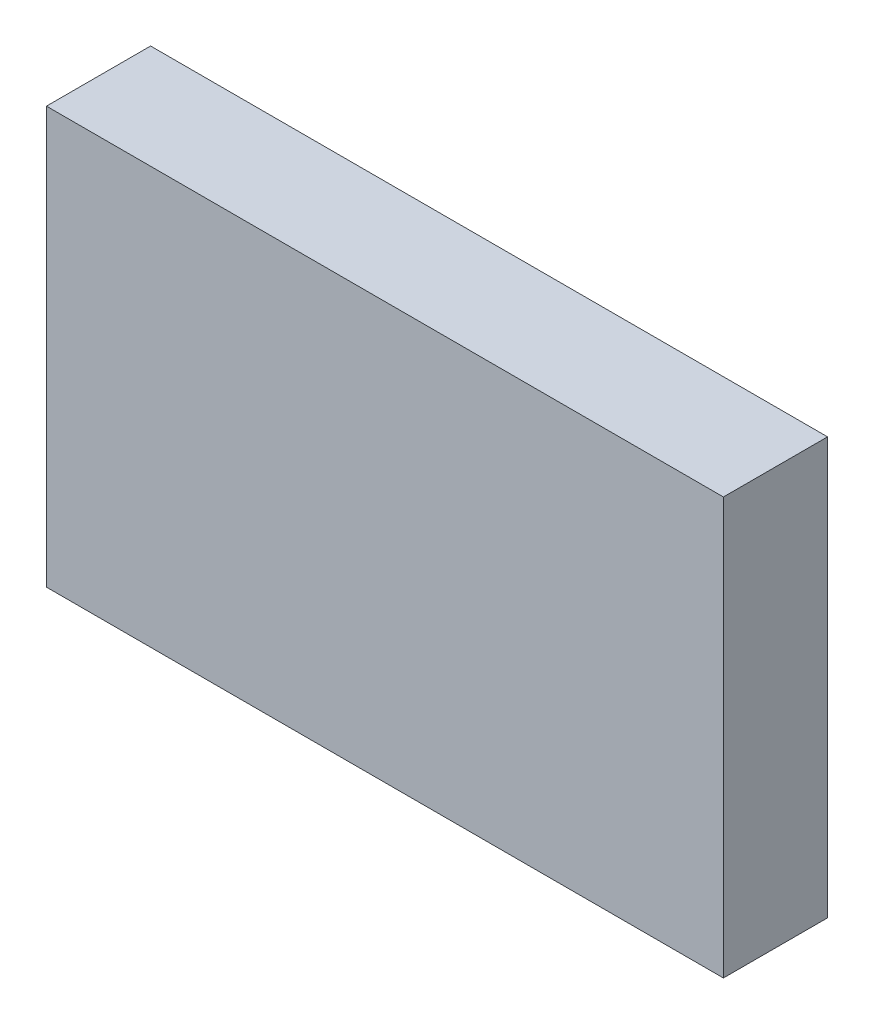
ISO-10303-21;
HEADER;
FILE_DESCRIPTION(('STEP AP214'),'2;1');
FILE_NAME('part.step','',(''),(''),'','','');
FILE_SCHEMA(('AUTOMOTIVE_DESIGN { 1 0 10303 214 1 1 1 1 }'));
ENDSEC;
DATA;
#1=APPLICATION_CONTEXT('core data for automotive mechanical design processes');
#2=APPLICATION_PROTOCOL_DEFINITION('international standard','automotive_design',2000,#1);
#3=PRODUCT_CONTEXT('',#1,'mechanical');
#4=PRODUCT('Part','Part','',(#3));
#5=PRODUCT_RELATED_PRODUCT_CATEGORY('part','',(#4));
#6=PRODUCT_DEFINITION_FORMATION('','',#4);
#7=PRODUCT_DEFINITION_CONTEXT('part definition',#1,'design');
#8=PRODUCT_DEFINITION('design','',#6,#7);
#9=PRODUCT_DEFINITION_SHAPE('','',#8);
#10=(LENGTH_UNIT() NAMED_UNIT(*) SI_UNIT(.MILLI.,.METRE.));
#11=(NAMED_UNIT(*) PLANE_ANGLE_UNIT() SI_UNIT($,.RADIAN.));
#12=(NAMED_UNIT(*) SI_UNIT($,.STERADIAN.) SOLID_ANGLE_UNIT());
#13=UNCERTAINTY_MEASURE_WITH_UNIT(LENGTH_MEASURE(1.E-05),#10,'distance_accuracy_value','');
#14=(GEOMETRIC_REPRESENTATION_CONTEXT(3) GLOBAL_UNCERTAINTY_ASSIGNED_CONTEXT((#13)) GLOBAL_UNIT_ASSIGNED_CONTEXT((#10,
#11,#12)) REPRESENTATION_CONTEXT('',''));
#15=CARTESIAN_POINT('',(0.,0.,0.));
#16=DIRECTION('',(0.,0.,1.));
#17=DIRECTION('',(1.,0.,0.));
#18=AXIS2_PLACEMENT_3D('',#15,#16,#17);
#19=CARTESIAN_POINT('',(0.,8.,2.));
#20=DIRECTION('',(1.,0.,0.));
#21=DIRECTION('',(0.,0.,-1.));
#22=AXIS2_PLACEMENT_3D('',#19,#20,#21);
#23=PLANE('',#22);
#24=DIRECTION('',(0.,-1.,0.));
#25=VECTOR('',#24,1.);
#26=CARTESIAN_POINT('',(0.,8.,0.));
#27=LINE('',#26,#25);
#28=CARTESIAN_POINT('',(0.,8.,0.));
#29=VERTEX_POINT('',#28);
#30=CARTESIAN_POINT('',(0.,0.,0.));
#31=VERTEX_POINT('',#30);
#32=EDGE_CURVE('E102',#29,#31,#27,.T.);
#33=ORIENTED_EDGE('',*,*,#32,.T.);
#34=DIRECTION('',(0.,0.,-1.));
#35=VECTOR('',#34,1.);
#36=CARTESIAN_POINT('',(0.,0.,2.));
#37=LINE('',#36,#35);
#38=CARTESIAN_POINT('',(0.,0.,2.));
#39=VERTEX_POINT('',#38);
#40=EDGE_CURVE('E11',#39,#31,#37,.T.);
#41=ORIENTED_EDGE('',*,*,#40,.F.);
#42=DIRECTION('',(0.,-1.,0.));
#43=VECTOR('',#42,1.);
#44=CARTESIAN_POINT('',(0.,8.,2.));
#45=LINE('',#44,#43);
#46=CARTESIAN_POINT('',(0.,8.,2.));
#47=VERTEX_POINT('',#46);
#48=EDGE_CURVE('E90',#47,#39,#45,.T.);
#49=ORIENTED_EDGE('',*,*,#48,.F.);
#50=DIRECTION('',(0.,0.,-1.));
#51=VECTOR('',#50,1.);
#52=CARTESIAN_POINT('',(0.,8.,2.));
#53=LINE('',#52,#51);
#54=EDGE_CURVE('E98',#47,#29,#53,.T.);
#55=ORIENTED_EDGE('',*,*,#54,.T.);
#56=EDGE_LOOP('',(#33,#41,#49,#55));
#57=FACE_BOUND('',#56,.T.);
#58=ADVANCED_FACE('F39',(#57),#23,.F.);
#59=CARTESIAN_POINT('',(0.,0.,2.));
#60=DIRECTION('',(0.,1.,0.));
#61=DIRECTION('',(0.,0.,1.));
#62=AXIS2_PLACEMENT_3D('',#59,#60,#61);
#63=PLANE('',#62);
#64=DIRECTION('',(1.,0.,0.));
#65=VECTOR('',#64,1.);
#66=CARTESIAN_POINT('',(0.,0.,0.));
#67=LINE('',#66,#65);
#68=CARTESIAN_POINT('',(13.,0.,0.));
#69=VERTEX_POINT('',#68);
#70=EDGE_CURVE('E94',#31,#69,#67,.T.);
#71=ORIENTED_EDGE('',*,*,#70,.T.);
#72=DIRECTION('',(0.,0.,-1.));
#73=VECTOR('',#72,1.);
#74=CARTESIAN_POINT('',(13.,0.,2.));
#75=LINE('',#74,#73);
#76=CARTESIAN_POINT('',(13.,0.,2.));
#77=VERTEX_POINT('',#76);
#78=EDGE_CURVE('E47',#77,#69,#75,.T.);
#79=ORIENTED_EDGE('',*,*,#78,.F.);
#80=DIRECTION('',(1.,0.,0.));
#81=VECTOR('',#80,1.);
#82=CARTESIAN_POINT('',(0.,0.,2.));
#83=LINE('',#82,#81);
#84=EDGE_CURVE('E85',#39,#77,#83,.T.);
#85=ORIENTED_EDGE('',*,*,#84,.F.);
#86=ORIENTED_EDGE('',*,*,#40,.T.);
#87=EDGE_LOOP('',(#71,#79,#85,#86));
#88=FACE_BOUND('',#87,.T.);
#89=ADVANCED_FACE('F93',(#88),#63,.F.);
#90=CARTESIAN_POINT('',(13.,0.,2.));
#91=DIRECTION('',(-1.,0.,0.));
#92=DIRECTION('',(0.,0.,1.));
#93=AXIS2_PLACEMENT_3D('',#90,#91,#92);
#94=PLANE('',#93);
#95=DIRECTION('',(0.,1.,0.));
#96=VECTOR('',#95,1.);
#97=CARTESIAN_POINT('',(13.,0.,0.));
#98=LINE('',#97,#96);
#99=CARTESIAN_POINT('',(13.,8.,0.));
#100=VERTEX_POINT('',#99);
#101=EDGE_CURVE('E72',#69,#100,#98,.T.);
#102=ORIENTED_EDGE('',*,*,#101,.T.);
#103=DIRECTION('',(0.,0.,-1.));
#104=VECTOR('',#103,1.);
#105=CARTESIAN_POINT('',(13.,8.,2.));
#106=LINE('',#105,#104);
#107=CARTESIAN_POINT('',(13.,8.,2.));
#108=VERTEX_POINT('',#107);
#109=EDGE_CURVE('E95',#108,#100,#106,.T.);
#110=ORIENTED_EDGE('',*,*,#109,.F.);
#111=DIRECTION('',(0.,1.,0.));
#112=VECTOR('',#111,1.);
#113=CARTESIAN_POINT('',(13.,0.,2.));
#114=LINE('',#113,#112);
#115=EDGE_CURVE('E88',#77,#108,#114,.T.);
#116=ORIENTED_EDGE('',*,*,#115,.F.);
#117=ORIENTED_EDGE('',*,*,#78,.T.);
#118=EDGE_LOOP('',(#102,#110,#116,#117));
#119=FACE_BOUND('',#118,.T.);
#120=ADVANCED_FACE('F96',(#119),#94,.F.);
#121=CARTESIAN_POINT('',(13.,8.,2.));
#122=DIRECTION('',(0.,-1.,0.));
#123=DIRECTION('',(0.,0.,-1.));
#124=AXIS2_PLACEMENT_3D('',#121,#122,#123);
#125=PLANE('',#124);
#126=DIRECTION('',(-1.,0.,0.));
#127=VECTOR('',#126,1.);
#128=CARTESIAN_POINT('',(13.,8.,0.));
#129=LINE('',#128,#127);
#130=EDGE_CURVE('E78',#100,#29,#129,.T.);
#131=ORIENTED_EDGE('',*,*,#130,.T.);
#132=ORIENTED_EDGE('',*,*,#54,.F.);
#133=DIRECTION('',(-1.,0.,0.));
#134=VECTOR('',#133,1.);
#135=CARTESIAN_POINT('',(13.,8.,2.));
#136=LINE('',#135,#134);
#137=EDGE_CURVE('E55',#108,#47,#136,.T.);
#138=ORIENTED_EDGE('',*,*,#137,.F.);
#139=ORIENTED_EDGE('',*,*,#109,.T.);
#140=EDGE_LOOP('',(#131,#132,#138,#139));
#141=FACE_BOUND('',#140,.T.);
#142=ADVANCED_FACE('F109',(#141),#125,.F.);
#143=CARTESIAN_POINT('',(0.,0.,2.));
#144=DIRECTION('',(0.,0.,1.));
#145=DIRECTION('',(1.,0.,0.));
#146=AXIS2_PLACEMENT_3D('',#143,#144,#145);
#147=PLANE('',#146);
#148=ORIENTED_EDGE('',*,*,#48,.T.);
#149=ORIENTED_EDGE('',*,*,#84,.T.);
#150=ORIENTED_EDGE('',*,*,#115,.T.);
#151=ORIENTED_EDGE('',*,*,#137,.T.);
#152=EDGE_LOOP('',(#148,#149,#150,#151));
#153=FACE_BOUND('',#152,.T.);
#154=ADVANCED_FACE('F86',(#153),#147,.T.);
#155=CARTESIAN_POINT('',(0.,0.,0.));
#156=DIRECTION('',(0.,0.,1.));
#157=DIRECTION('',(1.,0.,0.));
#158=AXIS2_PLACEMENT_3D('',#155,#156,#157);
#159=PLANE('',#158);
#160=ORIENTED_EDGE('',*,*,#32,.F.);
#161=ORIENTED_EDGE('',*,*,#130,.F.);
#162=ORIENTED_EDGE('',*,*,#101,.F.);
#163=ORIENTED_EDGE('',*,*,#70,.F.);
#164=EDGE_LOOP('',(#160,#161,#162,#163));
#165=FACE_BOUND('',#164,.T.);
#166=ADVANCED_FACE('F112',(#165),#159,.F.);
#167=CLOSED_SHELL('',(#58,#89,#120,#142,#154,#166));
#168=MANIFOLD_SOLID_BREP('B2',#167);
#169=ADVANCED_BREP_SHAPE_REPRESENTATION('',(#18,#168),#14);
#170=SHAPE_DEFINITION_REPRESENTATION(#9,#169);
ENDSEC;
END-ISO-10303-21;
